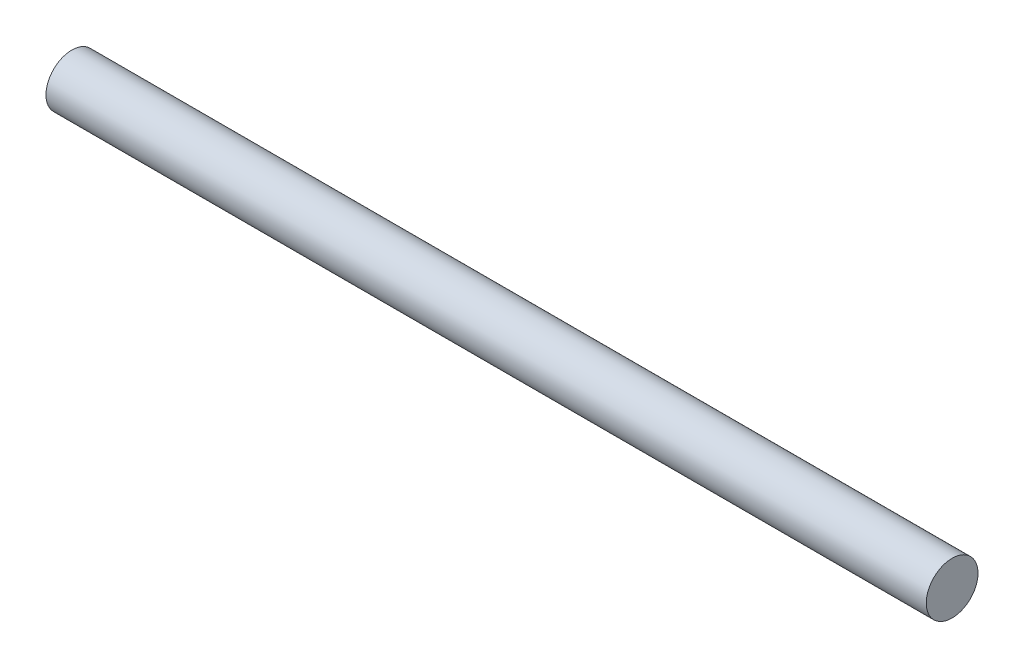
ISO-10303-21;
HEADER;
FILE_DESCRIPTION(('STEP AP214'),'2;1');
FILE_NAME('part.step','',(''),(''),'','','');
FILE_SCHEMA(('AUTOMOTIVE_DESIGN { 1 0 10303 214 1 1 1 1 }'));
ENDSEC;
DATA;
#1=APPLICATION_CONTEXT('core data for automotive mechanical design processes');
#2=APPLICATION_PROTOCOL_DEFINITION('international standard','automotive_design',2000,#1);
#3=PRODUCT_CONTEXT('',#1,'mechanical');
#4=PRODUCT('Part','Part','',(#3));
#5=PRODUCT_RELATED_PRODUCT_CATEGORY('part','',(#4));
#6=PRODUCT_DEFINITION_FORMATION('','',#4);
#7=PRODUCT_DEFINITION_CONTEXT('part definition',#1,'design');
#8=PRODUCT_DEFINITION('design','',#6,#7);
#9=PRODUCT_DEFINITION_SHAPE('','',#8);
#10=(LENGTH_UNIT() NAMED_UNIT(*) SI_UNIT(.MILLI.,.METRE.));
#11=(NAMED_UNIT(*) PLANE_ANGLE_UNIT() SI_UNIT($,.RADIAN.));
#12=(NAMED_UNIT(*) SI_UNIT($,.STERADIAN.) SOLID_ANGLE_UNIT());
#13=UNCERTAINTY_MEASURE_WITH_UNIT(LENGTH_MEASURE(1.E-05),#10,'distance_accuracy_value','');
#14=(GEOMETRIC_REPRESENTATION_CONTEXT(3) GLOBAL_UNCERTAINTY_ASSIGNED_CONTEXT((#13)) GLOBAL_UNIT_ASSIGNED_CONTEXT((#10,
#11,#12)) REPRESENTATION_CONTEXT('',''));
#15=CARTESIAN_POINT('',(0.,0.,0.));
#16=DIRECTION('',(0.,0.,1.));
#17=DIRECTION('',(1.,0.,0.));
#18=AXIS2_PLACEMENT_3D('',#15,#16,#17);
#19=CARTESIAN_POINT('',(340.,0.,0.));
#20=DIRECTION('',(-1.,0.,0.));
#21=DIRECTION('',(0.,0.,1.));
#22=AXIS2_PLACEMENT_3D('',#19,#20,#21);
#23=CYLINDRICAL_SURFACE('',#22,10.);
#24=CARTESIAN_POINT('',(340.,0.,0.));
#25=DIRECTION('',(1.,0.,0.));
#26=DIRECTION('',(0.,0.,-1.));
#27=AXIS2_PLACEMENT_3D('',#24,#25,#26);
#28=CIRCLE('',#27,10.);
#29=CARTESIAN_POINT('',(340.,0.,-10.));
#30=VERTEX_POINT('',#29);
#31=EDGE_CURVE('E10',#30,#30,#28,.T.);
#32=ORIENTED_EDGE('',*,*,#31,.F.);
#33=EDGE_LOOP('',(#32));
#34=FACE_BOUND('',#33,.T.);
#35=CARTESIAN_POINT('',(0.,0.,0.));
#36=DIRECTION('',(1.,0.,0.));
#37=DIRECTION('',(0.,0.,-1.));
#38=AXIS2_PLACEMENT_3D('',#35,#36,#37);
#39=CIRCLE('',#38,10.);
#40=CARTESIAN_POINT('',(0.,0.,-10.));
#41=VERTEX_POINT('',#40);
#42=EDGE_CURVE('E34',#41,#41,#39,.T.);
#43=ORIENTED_EDGE('',*,*,#42,.T.);
#44=EDGE_LOOP('',(#43));
#45=FACE_BOUND('',#44,.T.);
#46=ADVANCED_FACE('F31',(#34,#45),#23,.T.);
#47=CARTESIAN_POINT('',(340.,0.,0.));
#48=DIRECTION('',(1.,0.,0.));
#49=DIRECTION('',(0.,0.,-1.));
#50=AXIS2_PLACEMENT_3D('',#47,#48,#49);
#51=PLANE('',#50);
#52=ORIENTED_EDGE('',*,*,#31,.T.);
#53=EDGE_LOOP('',(#52));
#54=FACE_BOUND('',#53,.T.);
#55=ADVANCED_FACE('F46',(#54),#51,.T.);
#56=CARTESIAN_POINT('',(0.,0.,0.));
#57=DIRECTION('',(1.,0.,0.));
#58=DIRECTION('',(0.,0.,-1.));
#59=AXIS2_PLACEMENT_3D('',#56,#57,#58);
#60=PLANE('',#59);
#61=ORIENTED_EDGE('',*,*,#42,.F.);
#62=EDGE_LOOP('',(#61));
#63=FACE_BOUND('',#62,.T.);
#64=ADVANCED_FACE('F44',(#63),#60,.F.);
#65=CLOSED_SHELL('',(#46,#55,#64));
#66=MANIFOLD_SOLID_BREP('B2',#65);
#67=ADVANCED_BREP_SHAPE_REPRESENTATION('',(#18,#66),#14);
#68=SHAPE_DEFINITION_REPRESENTATION(#9,#67);
ENDSEC;
END-ISO-10303-21;
